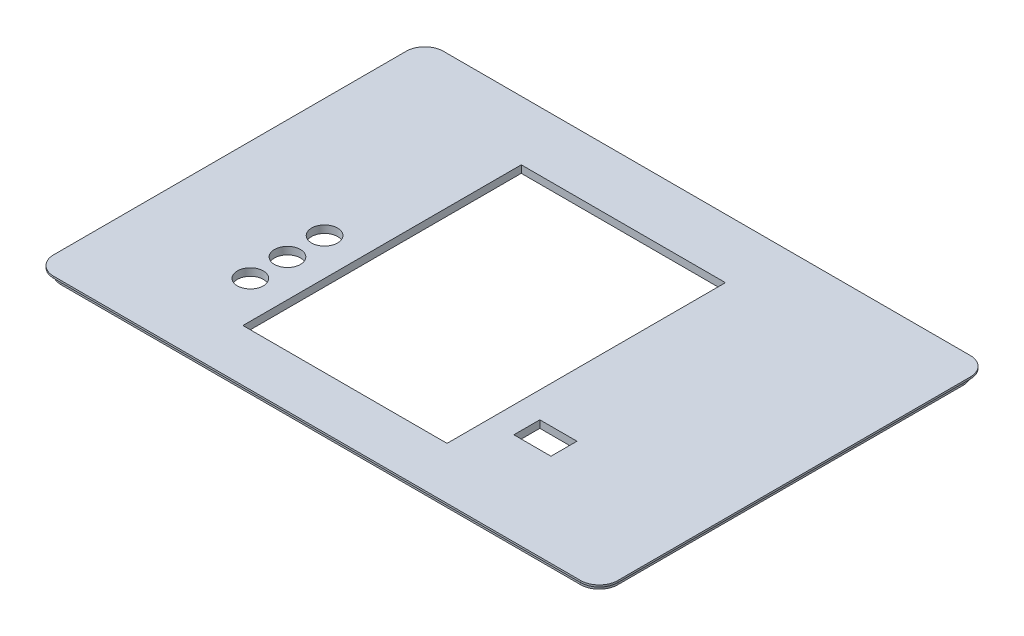
ISO-10303-21;
HEADER;
FILE_DESCRIPTION(('STEP AP214'),'2;1');
FILE_NAME('part.step','',(''),(''),'','','');
FILE_SCHEMA(('AUTOMOTIVE_DESIGN { 1 0 10303 214 1 1 1 1 }'));
ENDSEC;
DATA;
#1=APPLICATION_CONTEXT('core data for automotive mechanical design processes');
#2=APPLICATION_PROTOCOL_DEFINITION('international standard','automotive_design',2000,#1);
#3=PRODUCT_CONTEXT('',#1,'mechanical');
#4=PRODUCT('Part','Part','',(#3));
#5=PRODUCT_RELATED_PRODUCT_CATEGORY('part','',(#4));
#6=PRODUCT_DEFINITION_FORMATION('','',#4);
#7=PRODUCT_DEFINITION_CONTEXT('part definition',#1,'design');
#8=PRODUCT_DEFINITION('design','',#6,#7);
#9=PRODUCT_DEFINITION_SHAPE('','',#8);
#10=(LENGTH_UNIT() NAMED_UNIT(*) SI_UNIT(.MILLI.,.METRE.));
#11=(NAMED_UNIT(*) PLANE_ANGLE_UNIT() SI_UNIT($,.RADIAN.));
#12=(NAMED_UNIT(*) SI_UNIT($,.STERADIAN.) SOLID_ANGLE_UNIT());
#13=UNCERTAINTY_MEASURE_WITH_UNIT(LENGTH_MEASURE(1.E-05),#10,'distance_accuracy_value','');
#14=(GEOMETRIC_REPRESENTATION_CONTEXT(3) GLOBAL_UNCERTAINTY_ASSIGNED_CONTEXT((#13)) GLOBAL_UNIT_ASSIGNED_CONTEXT((#10,
#11,#12)) REPRESENTATION_CONTEXT('',''));
#15=CARTESIAN_POINT('',(0.,0.,0.));
#16=DIRECTION('',(0.,0.,1.));
#17=DIRECTION('',(1.,0.,0.));
#18=AXIS2_PLACEMENT_3D('',#15,#16,#17);
#19=CARTESIAN_POINT('',(-71.,0.5,47.5));
#20=DIRECTION('',(0.,-1.,0.));
#21=DIRECTION('',(0.,0.,-1.));
#22=AXIS2_PLACEMENT_3D('',#19,#20,#21);
#23=CYLINDRICAL_SURFACE('',#22,5.00000000000001);
#24=CARTESIAN_POINT('',(-71.,0.,47.5));
#25=DIRECTION('',(0.,1.,0.));
#26=DIRECTION('',(0.,0.,-1.));
#27=AXIS2_PLACEMENT_3D('',#24,#25,#26);
#28=CIRCLE('',#27,5.00000000000001);
#29=CARTESIAN_POINT('',(-76.,0.,47.5));
#30=VERTEX_POINT('',#29);
#31=CARTESIAN_POINT('',(-71.,0.,52.5));
#32=VERTEX_POINT('',#31);
#33=EDGE_CURVE('E358',#30,#32,#28,.T.);
#34=ORIENTED_EDGE('',*,*,#33,.T.);
#35=DIRECTION('',(0.,-1.,0.));
#36=VECTOR('',#35,1.);
#37=CARTESIAN_POINT('',(-71.,0.5,52.5));
#38=LINE('',#37,#36);
#39=CARTESIAN_POINT('',(-71.,0.5,52.5));
#40=VERTEX_POINT('',#39);
#41=EDGE_CURVE('E436',#40,#32,#38,.T.);
#42=ORIENTED_EDGE('',*,*,#41,.F.);
#43=CARTESIAN_POINT('',(-71.,0.5,47.5));
#44=DIRECTION('',(0.,1.,0.));
#45=DIRECTION('',(0.,0.,-1.));
#46=AXIS2_PLACEMENT_3D('',#43,#44,#45);
#47=CIRCLE('',#46,5.00000000000001);
#48=CARTESIAN_POINT('',(-76.,0.5,47.5));
#49=VERTEX_POINT('',#48);
#50=EDGE_CURVE('E359',#49,#40,#47,.T.);
#51=ORIENTED_EDGE('',*,*,#50,.F.);
#52=DIRECTION('',(0.,-1.,0.));
#53=VECTOR('',#52,1.);
#54=CARTESIAN_POINT('',(-76.,0.5,47.5));
#55=LINE('',#54,#53);
#56=EDGE_CURVE('E385',#49,#30,#55,.T.);
#57=ORIENTED_EDGE('',*,*,#56,.T.);
#58=EDGE_LOOP('',(#34,#42,#51,#57));
#59=FACE_BOUND('',#58,.T.);
#60=ADVANCED_FACE('F43',(#59),#23,.T.);
#61=CARTESIAN_POINT('',(71.,0.5,52.5));
#62=DIRECTION('',(0.,0.,-1.));
#63=DIRECTION('',(-1.,0.,0.));
#64=AXIS2_PLACEMENT_3D('',#61,#62,#63);
#65=PLANE('',#64);
#66=DIRECTION('',(1.,0.,0.));
#67=VECTOR('',#66,1.);
#68=CARTESIAN_POINT('',(71.,0.,52.5));
#69=LINE('',#68,#67);
#70=CARTESIAN_POINT('',(71.,0.,52.5));
#71=VERTEX_POINT('',#70);
#72=EDGE_CURVE('E389',#32,#71,#69,.T.);
#73=ORIENTED_EDGE('',*,*,#72,.T.);
#74=DIRECTION('',(0.,-1.,0.));
#75=VECTOR('',#74,1.);
#76=CARTESIAN_POINT('',(71.,0.5,52.5));
#77=LINE('',#76,#75);
#78=CARTESIAN_POINT('',(71.,0.5,52.5));
#79=VERTEX_POINT('',#78);
#80=EDGE_CURVE('E432',#79,#71,#77,.T.);
#81=ORIENTED_EDGE('',*,*,#80,.F.);
#82=DIRECTION('',(1.,0.,0.));
#83=VECTOR('',#82,1.);
#84=CARTESIAN_POINT('',(71.,0.5,52.5));
#85=LINE('',#84,#83);
#86=EDGE_CURVE('E363',#40,#79,#85,.T.);
#87=ORIENTED_EDGE('',*,*,#86,.F.);
#88=ORIENTED_EDGE('',*,*,#41,.T.);
#89=EDGE_LOOP('',(#73,#81,#87,#88));
#90=FACE_BOUND('',#89,.T.);
#91=ADVANCED_FACE('F587',(#90),#65,.F.);
#92=CARTESIAN_POINT('',(71.,0.5,47.5));
#93=DIRECTION('',(0.,-1.,0.));
#94=DIRECTION('',(0.,0.,-1.));
#95=AXIS2_PLACEMENT_3D('',#92,#93,#94);
#96=CYLINDRICAL_SURFACE('',#95,4.99999999999999);
#97=CARTESIAN_POINT('',(71.,0.,47.5));
#98=DIRECTION('',(0.,1.,0.));
#99=DIRECTION('',(0.,0.,1.));
#100=AXIS2_PLACEMENT_3D('',#97,#98,#99);
#101=CIRCLE('',#100,4.99999999999999);
#102=CARTESIAN_POINT('',(76.,0.,47.5));
#103=VERTEX_POINT('',#102);
#104=EDGE_CURVE('E392',#71,#103,#101,.T.);
#105=ORIENTED_EDGE('',*,*,#104,.T.);
#106=DIRECTION('',(0.,-1.,0.));
#107=VECTOR('',#106,1.);
#108=CARTESIAN_POINT('',(76.,0.5,47.5));
#109=LINE('',#108,#107);
#110=CARTESIAN_POINT('',(76.,0.5,47.5));
#111=VERTEX_POINT('',#110);
#112=EDGE_CURVE('E428',#111,#103,#109,.T.);
#113=ORIENTED_EDGE('',*,*,#112,.F.);
#114=CARTESIAN_POINT('',(71.,0.5,47.5));
#115=DIRECTION('',(0.,1.,0.));
#116=DIRECTION('',(0.,0.,1.));
#117=AXIS2_PLACEMENT_3D('',#114,#115,#116);
#118=CIRCLE('',#117,4.99999999999999);
#119=EDGE_CURVE('E367',#79,#111,#118,.T.);
#120=ORIENTED_EDGE('',*,*,#119,.F.);
#121=ORIENTED_EDGE('',*,*,#80,.T.);
#122=EDGE_LOOP('',(#105,#113,#120,#121));
#123=FACE_BOUND('',#122,.T.);
#124=ADVANCED_FACE('F583',(#123),#96,.T.);
#125=CARTESIAN_POINT('',(76.,0.5,47.5));
#126=DIRECTION('',(-1.,0.,0.));
#127=DIRECTION('',(0.,0.,1.));
#128=AXIS2_PLACEMENT_3D('',#125,#126,#127);
#129=PLANE('',#128);
#130=DIRECTION('',(0.,0.,-1.));
#131=VECTOR('',#130,1.);
#132=CARTESIAN_POINT('',(76.,0.,47.5));
#133=LINE('',#132,#131);
#134=CARTESIAN_POINT('',(76.,0.,-47.5));
#135=VERTEX_POINT('',#134);
#136=EDGE_CURVE('E395',#103,#135,#133,.T.);
#137=ORIENTED_EDGE('',*,*,#136,.T.);
#138=DIRECTION('',(0.,-1.,0.));
#139=VECTOR('',#138,1.);
#140=CARTESIAN_POINT('',(76.,0.5,-47.5));
#141=LINE('',#140,#139);
#142=CARTESIAN_POINT('',(76.,0.5,-47.5));
#143=VERTEX_POINT('',#142);
#144=EDGE_CURVE('E424',#143,#135,#141,.T.);
#145=ORIENTED_EDGE('',*,*,#144,.F.);
#146=DIRECTION('',(0.,0.,-1.));
#147=VECTOR('',#146,1.);
#148=CARTESIAN_POINT('',(76.,0.5,47.5));
#149=LINE('',#148,#147);
#150=EDGE_CURVE('E370',#111,#143,#149,.T.);
#151=ORIENTED_EDGE('',*,*,#150,.F.);
#152=ORIENTED_EDGE('',*,*,#112,.T.);
#153=EDGE_LOOP('',(#137,#145,#151,#152));
#154=FACE_BOUND('',#153,.T.);
#155=ADVANCED_FACE('F580',(#154),#129,.F.);
#156=CARTESIAN_POINT('',(71.,0.5,-47.5));
#157=DIRECTION('',(0.,-1.,0.));
#158=DIRECTION('',(0.,0.,-1.));
#159=AXIS2_PLACEMENT_3D('',#156,#157,#158);
#160=CYLINDRICAL_SURFACE('',#159,4.99999999999999);
#161=CARTESIAN_POINT('',(71.,0.,-47.5));
#162=DIRECTION('',(0.,1.,0.));
#163=DIRECTION('',(0.,0.,1.));
#164=AXIS2_PLACEMENT_3D('',#161,#162,#163);
#165=CIRCLE('',#164,4.99999999999999);
#166=CARTESIAN_POINT('',(71.,0.,-52.5));
#167=VERTEX_POINT('',#166);
#168=EDGE_CURVE('E398',#135,#167,#165,.T.);
#169=ORIENTED_EDGE('',*,*,#168,.T.);
#170=DIRECTION('',(0.,-1.,0.));
#171=VECTOR('',#170,1.);
#172=CARTESIAN_POINT('',(71.,0.5,-52.5));
#173=LINE('',#172,#171);
#174=CARTESIAN_POINT('',(71.,0.5,-52.5));
#175=VERTEX_POINT('',#174);
#176=EDGE_CURVE('E420',#175,#167,#173,.T.);
#177=ORIENTED_EDGE('',*,*,#176,.F.);
#178=CARTESIAN_POINT('',(71.,0.5,-47.5));
#179=DIRECTION('',(0.,1.,0.));
#180=DIRECTION('',(0.,0.,1.));
#181=AXIS2_PLACEMENT_3D('',#178,#179,#180);
#182=CIRCLE('',#181,4.99999999999999);
#183=EDGE_CURVE('E373',#143,#175,#182,.T.);
#184=ORIENTED_EDGE('',*,*,#183,.F.);
#185=ORIENTED_EDGE('',*,*,#144,.T.);
#186=EDGE_LOOP('',(#169,#177,#184,#185));
#187=FACE_BOUND('',#186,.T.);
#188=ADVANCED_FACE('F576',(#187),#160,.T.);
#189=CARTESIAN_POINT('',(71.,0.5,-52.5));
#190=DIRECTION('',(0.,0.,1.));
#191=DIRECTION('',(1.,0.,0.));
#192=AXIS2_PLACEMENT_3D('',#189,#190,#191);
#193=PLANE('',#192);
#194=DIRECTION('',(-1.,0.,0.));
#195=VECTOR('',#194,1.);
#196=CARTESIAN_POINT('',(71.,0.,-52.5));
#197=LINE('',#196,#195);
#198=CARTESIAN_POINT('',(-71.,0.,-52.5));
#199=VERTEX_POINT('',#198);
#200=EDGE_CURVE('E401',#167,#199,#197,.T.);
#201=ORIENTED_EDGE('',*,*,#200,.T.);
#202=DIRECTION('',(0.,-1.,0.));
#203=VECTOR('',#202,1.);
#204=CARTESIAN_POINT('',(-71.,0.5,-52.5));
#205=LINE('',#204,#203);
#206=CARTESIAN_POINT('',(-71.,0.5,-52.5));
#207=VERTEX_POINT('',#206);
#208=EDGE_CURVE('E416',#207,#199,#205,.T.);
#209=ORIENTED_EDGE('',*,*,#208,.F.);
#210=DIRECTION('',(-1.,0.,0.));
#211=VECTOR('',#210,1.);
#212=CARTESIAN_POINT('',(71.,0.5,-52.5));
#213=LINE('',#212,#211);
#214=EDGE_CURVE('E376',#175,#207,#213,.T.);
#215=ORIENTED_EDGE('',*,*,#214,.F.);
#216=ORIENTED_EDGE('',*,*,#176,.T.);
#217=EDGE_LOOP('',(#201,#209,#215,#216));
#218=FACE_BOUND('',#217,.T.);
#219=ADVANCED_FACE('F571',(#218),#193,.F.);
#220=CARTESIAN_POINT('',(-71.,0.5,-47.5));
#221=DIRECTION('',(0.,-1.,0.));
#222=DIRECTION('',(0.,0.,-1.));
#223=AXIS2_PLACEMENT_3D('',#220,#221,#222);
#224=CYLINDRICAL_SURFACE('',#223,5.00000000000001);
#225=CARTESIAN_POINT('',(-71.,0.,-47.5));
#226=DIRECTION('',(0.,1.,0.));
#227=DIRECTION('',(0.,0.,1.));
#228=AXIS2_PLACEMENT_3D('',#225,#226,#227);
#229=CIRCLE('',#228,5.00000000000001);
#230=CARTESIAN_POINT('',(-76.,0.,-47.5));
#231=VERTEX_POINT('',#230);
#232=EDGE_CURVE('E404',#199,#231,#229,.T.);
#233=ORIENTED_EDGE('',*,*,#232,.T.);
#234=DIRECTION('',(0.,-1.,0.));
#235=VECTOR('',#234,1.);
#236=CARTESIAN_POINT('',(-76.,0.5,-47.5));
#237=LINE('',#236,#235);
#238=CARTESIAN_POINT('',(-76.,0.5,-47.5));
#239=VERTEX_POINT('',#238);
#240=EDGE_CURVE('E412',#239,#231,#237,.T.);
#241=ORIENTED_EDGE('',*,*,#240,.F.);
#242=CARTESIAN_POINT('',(-71.,0.5,-47.5));
#243=DIRECTION('',(0.,1.,0.));
#244=DIRECTION('',(0.,0.,1.));
#245=AXIS2_PLACEMENT_3D('',#242,#243,#244);
#246=CIRCLE('',#245,5.00000000000001);
#247=EDGE_CURVE('E379',#207,#239,#246,.T.);
#248=ORIENTED_EDGE('',*,*,#247,.F.);
#249=ORIENTED_EDGE('',*,*,#208,.T.);
#250=EDGE_LOOP('',(#233,#241,#248,#249));
#251=FACE_BOUND('',#250,.T.);
#252=ADVANCED_FACE('F565',(#251),#224,.T.);
#253=CARTESIAN_POINT('',(-76.,0.5,47.5));
#254=DIRECTION('',(1.,0.,0.));
#255=DIRECTION('',(0.,0.,-1.));
#256=AXIS2_PLACEMENT_3D('',#253,#254,#255);
#257=PLANE('',#256);
#258=DIRECTION('',(0.,0.,1.));
#259=VECTOR('',#258,1.);
#260=CARTESIAN_POINT('',(-76.,0.,47.5));
#261=LINE('',#260,#259);
#262=EDGE_CURVE('E364',#231,#30,#261,.T.);
#263=ORIENTED_EDGE('',*,*,#262,.T.);
#264=ORIENTED_EDGE('',*,*,#56,.F.);
#265=DIRECTION('',(0.,0.,1.));
#266=VECTOR('',#265,1.);
#267=CARTESIAN_POINT('',(-76.,0.5,47.5));
#268=LINE('',#267,#266);
#269=EDGE_CURVE('E382',#239,#49,#268,.T.);
#270=ORIENTED_EDGE('',*,*,#269,.F.);
#271=ORIENTED_EDGE('',*,*,#240,.T.);
#272=EDGE_LOOP('',(#263,#264,#270,#271));
#273=FACE_BOUND('',#272,.T.);
#274=ADVANCED_FACE('F497',(#273),#257,.F.);
#275=CARTESIAN_POINT('',(-71.,0.5,47.5));
#276=DIRECTION('',(0.,-1.,0.));
#277=DIRECTION('',(0.,0.,-1.));
#278=AXIS2_PLACEMENT_3D('',#275,#276,#277);
#279=PLANE('',#278);
#280=CARTESIAN_POINT('',(-44.,0.5,6.49999999999999));
#281=DIRECTION('',(0.,1.,0.));
#282=DIRECTION('',(0.,0.,1.));
#283=AXIS2_PLACEMENT_3D('',#280,#281,#282);
#284=CIRCLE('',#283,3.5);
#285=CARTESIAN_POINT('',(-44.,0.5,9.99999999999999));
#286=VERTEX_POINT('',#285);
#287=EDGE_CURVE('E468',#286,#286,#284,.T.);
#288=ORIENTED_EDGE('',*,*,#287,.F.);
#289=EDGE_LOOP('',(#288));
#290=FACE_BOUND('',#289,.T.);
#291=CARTESIAN_POINT('',(-44.,0.5,16.5));
#292=DIRECTION('',(0.,1.,0.));
#293=DIRECTION('',(0.,0.,1.));
#294=AXIS2_PLACEMENT_3D('',#291,#292,#293);
#295=CIRCLE('',#294,3.5);
#296=CARTESIAN_POINT('',(-44.,0.5,20.));
#297=VERTEX_POINT('',#296);
#298=EDGE_CURVE('E483',#297,#297,#295,.T.);
#299=ORIENTED_EDGE('',*,*,#298,.F.);
#300=EDGE_LOOP('',(#299));
#301=FACE_BOUND('',#300,.T.);
#302=CARTESIAN_POINT('',(-44.,0.5,26.5));
#303=DIRECTION('',(0.,1.,0.));
#304=DIRECTION('',(0.,0.,1.));
#305=AXIS2_PLACEMENT_3D('',#302,#303,#304);
#306=CIRCLE('',#305,3.5);
#307=CARTESIAN_POINT('',(-44.,0.5,30.));
#308=VERTEX_POINT('',#307);
#309=EDGE_CURVE('E479',#308,#308,#306,.T.);
#310=ORIENTED_EDGE('',*,*,#309,.F.);
#311=EDGE_LOOP('',(#310));
#312=FACE_BOUND('',#311,.T.);
#313=DIRECTION('',(1.,0.,0.));
#314=VECTOR('',#313,1.);
#315=CARTESIAN_POINT('',(28.,0.5,27.5));
#316=LINE('',#315,#314);
#317=CARTESIAN_POINT('',(28.,0.5,27.5));
#318=VERTEX_POINT('',#317);
#319=CARTESIAN_POINT('',(38.,0.5,27.5));
#320=VERTEX_POINT('',#319);
#321=EDGE_CURVE('E219',#318,#320,#316,.T.);
#322=ORIENTED_EDGE('',*,*,#321,.F.);
#323=DIRECTION('',(0.,0.,1.));
#324=VECTOR('',#323,1.);
#325=CARTESIAN_POINT('',(28.,0.5,20.5));
#326=LINE('',#325,#324);
#327=CARTESIAN_POINT('',(28.,0.5,20.5));
#328=VERTEX_POINT('',#327);
#329=EDGE_CURVE('E60',#328,#318,#326,.T.);
#330=ORIENTED_EDGE('',*,*,#329,.F.);
#331=DIRECTION('',(-1.,0.,0.));
#332=VECTOR('',#331,1.);
#333=CARTESIAN_POINT('',(28.,0.5,20.5));
#334=LINE('',#333,#332);
#335=CARTESIAN_POINT('',(38.,0.5,20.5));
#336=VERTEX_POINT('',#335);
#337=EDGE_CURVE('E227',#336,#328,#334,.T.);
#338=ORIENTED_EDGE('',*,*,#337,.F.);
#339=DIRECTION('',(0.,0.,-1.));
#340=VECTOR('',#339,1.);
#341=CARTESIAN_POINT('',(38.,0.5,20.5));
#342=LINE('',#341,#340);
#343=EDGE_CURVE('E209',#320,#336,#342,.T.);
#344=ORIENTED_EDGE('',*,*,#343,.F.);
#345=EDGE_LOOP('',(#322,#330,#338,#344));
#346=FACE_BOUND('',#345,.T.);
#347=DIRECTION('',(1.,0.,0.));
#348=VECTOR('',#347,1.);
#349=CARTESIAN_POINT('',(-34.,0.5,38.5));
#350=LINE('',#349,#348);
#351=CARTESIAN_POINT('',(-34.,0.5,38.5));
#352=VERTEX_POINT('',#351);
#353=CARTESIAN_POINT('',(21.,0.5,38.5));
#354=VERTEX_POINT('',#353);
#355=EDGE_CURVE('E244',#352,#354,#350,.T.);
#356=ORIENTED_EDGE('',*,*,#355,.F.);
#357=DIRECTION('',(0.,0.,1.));
#358=VECTOR('',#357,1.);
#359=CARTESIAN_POINT('',(-34.,0.5,-36.5));
#360=LINE('',#359,#358);
#361=CARTESIAN_POINT('',(-34.,0.5,-36.5));
#362=VERTEX_POINT('',#361);
#363=EDGE_CURVE('E237',#362,#352,#360,.T.);
#364=ORIENTED_EDGE('',*,*,#363,.F.);
#365=DIRECTION('',(-1.,0.,0.));
#366=VECTOR('',#365,1.);
#367=CARTESIAN_POINT('',(-34.,0.5,-36.5));
#368=LINE('',#367,#366);
#369=CARTESIAN_POINT('',(21.,0.5,-36.5));
#370=VERTEX_POINT('',#369);
#371=EDGE_CURVE('E252',#370,#362,#368,.T.);
#372=ORIENTED_EDGE('',*,*,#371,.F.);
#373=DIRECTION('',(0.,0.,-1.));
#374=VECTOR('',#373,1.);
#375=CARTESIAN_POINT('',(21.,0.5,-36.5));
#376=LINE('',#375,#374);
#377=EDGE_CURVE('E248',#354,#370,#376,.T.);
#378=ORIENTED_EDGE('',*,*,#377,.F.);
#379=EDGE_LOOP('',(#356,#364,#372,#378));
#380=FACE_BOUND('',#379,.T.);
#381=ORIENTED_EDGE('',*,*,#50,.T.);
#382=ORIENTED_EDGE('',*,*,#86,.T.);
#383=ORIENTED_EDGE('',*,*,#119,.T.);
#384=ORIENTED_EDGE('',*,*,#150,.T.);
#385=ORIENTED_EDGE('',*,*,#183,.T.);
#386=ORIENTED_EDGE('',*,*,#214,.T.);
#387=ORIENTED_EDGE('',*,*,#247,.T.);
#388=ORIENTED_EDGE('',*,*,#269,.T.);
#389=EDGE_LOOP('',(#381,#382,#383,#384,#385,#386,#387,#388));
#390=FACE_BOUND('',#389,.T.);
#391=ADVANCED_FACE('F224',(#290,#301,#312,#346,#380,#390),#279,.F.);
#392=CARTESIAN_POINT('',(-71.,0.,47.5));
#393=DIRECTION('',(0.,-1.,0.));
#394=DIRECTION('',(0.,0.,-1.));
#395=AXIS2_PLACEMENT_3D('',#392,#393,#394);
#396=PLANE('',#395);
#397=CARTESIAN_POINT('',(-70.,0.,-46.5));
#398=DIRECTION('',(0.,-1.,0.));
#399=DIRECTION('',(0.,0.,1.));
#400=AXIS2_PLACEMENT_3D('',#397,#398,#399);
#401=CIRCLE('',#400,5.);
#402=CARTESIAN_POINT('',(-75.,0.,-46.5));
#403=VERTEX_POINT('',#402);
#404=CARTESIAN_POINT('',(-70.,0.,-51.5));
#405=VERTEX_POINT('',#404);
#406=EDGE_CURVE('E260',#403,#405,#401,.T.);
#407=ORIENTED_EDGE('',*,*,#406,.F.);
#408=DIRECTION('',(0.,0.,-1.));
#409=VECTOR('',#408,1.);
#410=CARTESIAN_POINT('',(-75.,0.,-46.5));
#411=LINE('',#410,#409);
#412=CARTESIAN_POINT('',(-75.,0.,46.5));
#413=VERTEX_POINT('',#412);
#414=EDGE_CURVE('E275',#413,#403,#411,.T.);
#415=ORIENTED_EDGE('',*,*,#414,.F.);
#416=CARTESIAN_POINT('',(-70.,0.,46.5));
#417=DIRECTION('',(0.,-1.,0.));
#418=DIRECTION('',(0.,0.,-1.));
#419=AXIS2_PLACEMENT_3D('',#416,#417,#418);
#420=CIRCLE('',#419,5.);
#421=CARTESIAN_POINT('',(-70.,0.,51.5));
#422=VERTEX_POINT('',#421);
#423=EDGE_CURVE('E320',#422,#413,#420,.T.);
#424=ORIENTED_EDGE('',*,*,#423,.F.);
#425=DIRECTION('',(-1.,0.,0.));
#426=VECTOR('',#425,1.);
#427=CARTESIAN_POINT('',(70.,0.,51.5));
#428=LINE('',#427,#426);
#429=CARTESIAN_POINT('',(70.,0.,51.5));
#430=VERTEX_POINT('',#429);
#431=EDGE_CURVE('E316',#430,#422,#428,.T.);
#432=ORIENTED_EDGE('',*,*,#431,.F.);
#433=CARTESIAN_POINT('',(70.,0.,46.5));
#434=DIRECTION('',(0.,-1.,0.));
#435=DIRECTION('',(0.,0.,-1.));
#436=AXIS2_PLACEMENT_3D('',#433,#434,#435);
#437=CIRCLE('',#436,5.);
#438=CARTESIAN_POINT('',(75.,0.,46.5));
#439=VERTEX_POINT('',#438);
#440=EDGE_CURVE('E312',#439,#430,#437,.T.);
#441=ORIENTED_EDGE('',*,*,#440,.F.);
#442=DIRECTION('',(0.,0.,1.));
#443=VECTOR('',#442,1.);
#444=CARTESIAN_POINT('',(75.,0.,-46.5));
#445=LINE('',#444,#443);
#446=CARTESIAN_POINT('',(75.,0.,-46.5));
#447=VERTEX_POINT('',#446);
#448=EDGE_CURVE('E308',#447,#439,#445,.T.);
#449=ORIENTED_EDGE('',*,*,#448,.F.);
#450=CARTESIAN_POINT('',(70.,0.,-46.5));
#451=DIRECTION('',(0.,-1.,0.));
#452=DIRECTION('',(0.,0.,-1.));
#453=AXIS2_PLACEMENT_3D('',#450,#451,#452);
#454=CIRCLE('',#453,5.);
#455=CARTESIAN_POINT('',(70.,0.,-51.5));
#456=VERTEX_POINT('',#455);
#457=EDGE_CURVE('E304',#456,#447,#454,.T.);
#458=ORIENTED_EDGE('',*,*,#457,.F.);
#459=DIRECTION('',(1.,0.,0.));
#460=VECTOR('',#459,1.);
#461=CARTESIAN_POINT('',(70.,0.,-51.5));
#462=LINE('',#461,#460);
#463=EDGE_CURVE('E300',#405,#456,#462,.T.);
#464=ORIENTED_EDGE('',*,*,#463,.F.);
#465=EDGE_LOOP('',(#407,#415,#424,#432,#441,#449,#458,#464));
#466=FACE_BOUND('',#465,.T.);
#467=ORIENTED_EDGE('',*,*,#33,.F.);
#468=ORIENTED_EDGE('',*,*,#262,.F.);
#469=ORIENTED_EDGE('',*,*,#232,.F.);
#470=ORIENTED_EDGE('',*,*,#200,.F.);
#471=ORIENTED_EDGE('',*,*,#168,.F.);
#472=ORIENTED_EDGE('',*,*,#136,.F.);
#473=ORIENTED_EDGE('',*,*,#104,.F.);
#474=ORIENTED_EDGE('',*,*,#72,.F.);
#475=EDGE_LOOP('',(#467,#468,#469,#470,#471,#472,#473,#474));
#476=FACE_BOUND('',#475,.T.);
#477=ADVANCED_FACE('F496',(#466,#476),#396,.T.);
#478=CARTESIAN_POINT('',(-70.,-1.5,-46.5));
#479=DIRECTION('',(0.,1.,0.));
#480=DIRECTION('',(0.,0.,1.));
#481=AXIS2_PLACEMENT_3D('',#478,#479,#480);
#482=CYLINDRICAL_SURFACE('',#481,5.);
#483=ORIENTED_EDGE('',*,*,#406,.T.);
#484=DIRECTION('',(0.,1.,0.));
#485=VECTOR('',#484,1.);
#486=CARTESIAN_POINT('',(-70.,-1.5,-51.5));
#487=LINE('',#486,#485);
#488=CARTESIAN_POINT('',(-70.,-1.5,-51.5));
#489=VERTEX_POINT('',#488);
#490=EDGE_CURVE('E354',#489,#405,#487,.T.);
#491=ORIENTED_EDGE('',*,*,#490,.F.);
#492=CARTESIAN_POINT('',(-70.,-1.5,-46.5));
#493=DIRECTION('',(0.,-1.,0.));
#494=DIRECTION('',(0.,0.,1.));
#495=AXIS2_PLACEMENT_3D('',#492,#493,#494);
#496=CIRCLE('',#495,5.);
#497=CARTESIAN_POINT('',(-75.,-1.5,-46.5));
#498=VERTEX_POINT('',#497);
#499=EDGE_CURVE('E270',#498,#489,#496,.T.);
#500=ORIENTED_EDGE('',*,*,#499,.F.);
#501=DIRECTION('',(0.,1.,0.));
#502=VECTOR('',#501,1.);
#503=CARTESIAN_POINT('',(-75.,-1.5,-46.5));
#504=LINE('',#503,#502);
#505=EDGE_CURVE('E296',#498,#403,#504,.T.);
#506=ORIENTED_EDGE('',*,*,#505,.T.);
#507=EDGE_LOOP('',(#483,#491,#500,#506));
#508=FACE_BOUND('',#507,.T.);
#509=ADVANCED_FACE('F524',(#508),#482,.T.);
#510=CARTESIAN_POINT('',(70.,-1.5,-51.5));
#511=DIRECTION('',(0.,0.,1.));
#512=DIRECTION('',(1.,0.,0.));
#513=AXIS2_PLACEMENT_3D('',#510,#511,#512);
#514=PLANE('',#513);
#515=ORIENTED_EDGE('',*,*,#463,.T.);
#516=DIRECTION('',(0.,1.,0.));
#517=VECTOR('',#516,1.);
#518=CARTESIAN_POINT('',(70.,-1.5,-51.5));
#519=LINE('',#518,#517);
#520=CARTESIAN_POINT('',(70.,-1.5,-51.5));
#521=VERTEX_POINT('',#520);
#522=EDGE_CURVE('E350',#521,#456,#519,.T.);
#523=ORIENTED_EDGE('',*,*,#522,.F.);
#524=DIRECTION('',(1.,0.,0.));
#525=VECTOR('',#524,1.);
#526=CARTESIAN_POINT('',(70.,-1.5,-51.5));
#527=LINE('',#526,#525);
#528=EDGE_CURVE('E274',#489,#521,#527,.T.);
#529=ORIENTED_EDGE('',*,*,#528,.F.);
#530=ORIENTED_EDGE('',*,*,#490,.T.);
#531=EDGE_LOOP('',(#515,#523,#529,#530));
#532=FACE_BOUND('',#531,.T.);
#533=ADVANCED_FACE('F526',(#532),#514,.F.);
#534=CARTESIAN_POINT('',(70.,-1.5,-46.5));
#535=DIRECTION('',(0.,1.,0.));
#536=DIRECTION('',(0.,0.,1.));
#537=AXIS2_PLACEMENT_3D('',#534,#535,#536);
#538=CYLINDRICAL_SURFACE('',#537,5.);
#539=ORIENTED_EDGE('',*,*,#457,.T.);
#540=DIRECTION('',(0.,1.,0.));
#541=VECTOR('',#540,1.);
#542=CARTESIAN_POINT('',(75.,-1.5,-46.5));
#543=LINE('',#542,#541);
#544=CARTESIAN_POINT('',(75.,-1.5,-46.5));
#545=VERTEX_POINT('',#544);
#546=EDGE_CURVE('E346',#545,#447,#543,.T.);
#547=ORIENTED_EDGE('',*,*,#546,.F.);
#548=CARTESIAN_POINT('',(70.,-1.5,-46.5));
#549=DIRECTION('',(0.,-1.,0.));
#550=DIRECTION('',(0.,0.,-1.));
#551=AXIS2_PLACEMENT_3D('',#548,#549,#550);
#552=CIRCLE('',#551,5.);
#553=EDGE_CURVE('E278',#521,#545,#552,.T.);
#554=ORIENTED_EDGE('',*,*,#553,.F.);
#555=ORIENTED_EDGE('',*,*,#522,.T.);
#556=EDGE_LOOP('',(#539,#547,#554,#555));
#557=FACE_BOUND('',#556,.T.);
#558=ADVANCED_FACE('F530',(#557),#538,.T.);
#559=CARTESIAN_POINT('',(75.,-1.5,-46.5));
#560=DIRECTION('',(-1.,0.,0.));
#561=DIRECTION('',(0.,0.,1.));
#562=AXIS2_PLACEMENT_3D('',#559,#560,#561);
#563=PLANE('',#562);
#564=ORIENTED_EDGE('',*,*,#448,.T.);
#565=DIRECTION('',(0.,1.,0.));
#566=VECTOR('',#565,1.);
#567=CARTESIAN_POINT('',(75.,-1.5,46.5));
#568=LINE('',#567,#566);
#569=CARTESIAN_POINT('',(75.,-1.5,46.5));
#570=VERTEX_POINT('',#569);
#571=EDGE_CURVE('E342',#570,#439,#568,.T.);
#572=ORIENTED_EDGE('',*,*,#571,.F.);
#573=DIRECTION('',(0.,0.,1.));
#574=VECTOR('',#573,1.);
#575=CARTESIAN_POINT('',(75.,-1.5,-46.5));
#576=LINE('',#575,#574);
#577=EDGE_CURVE('E281',#545,#570,#576,.T.);
#578=ORIENTED_EDGE('',*,*,#577,.F.);
#579=ORIENTED_EDGE('',*,*,#546,.T.);
#580=EDGE_LOOP('',(#564,#572,#578,#579));
#581=FACE_BOUND('',#580,.T.);
#582=ADVANCED_FACE('F536',(#581),#563,.F.);
#583=CARTESIAN_POINT('',(70.,-1.5,46.5));
#584=DIRECTION('',(0.,1.,0.));
#585=DIRECTION('',(0.,0.,1.));
#586=AXIS2_PLACEMENT_3D('',#583,#584,#585);
#587=CYLINDRICAL_SURFACE('',#586,5.);
#588=ORIENTED_EDGE('',*,*,#440,.T.);
#589=DIRECTION('',(0.,1.,0.));
#590=VECTOR('',#589,1.);
#591=CARTESIAN_POINT('',(70.,-1.5,51.5));
#592=LINE('',#591,#590);
#593=CARTESIAN_POINT('',(70.,-1.5,51.5));
#594=VERTEX_POINT('',#593);
#595=EDGE_CURVE('E338',#594,#430,#592,.T.);
#596=ORIENTED_EDGE('',*,*,#595,.F.);
#597=CARTESIAN_POINT('',(70.,-1.5,46.5));
#598=DIRECTION('',(0.,-1.,0.));
#599=DIRECTION('',(0.,0.,-1.));
#600=AXIS2_PLACEMENT_3D('',#597,#598,#599);
#601=CIRCLE('',#600,5.);
#602=EDGE_CURVE('E284',#570,#594,#601,.T.);
#603=ORIENTED_EDGE('',*,*,#602,.F.);
#604=ORIENTED_EDGE('',*,*,#571,.T.);
#605=EDGE_LOOP('',(#588,#596,#603,#604));
#606=FACE_BOUND('',#605,.T.);
#607=ADVANCED_FACE('F538',(#606),#587,.T.);
#608=CARTESIAN_POINT('',(70.,-1.5,51.5));
#609=DIRECTION('',(0.,0.,-1.));
#610=DIRECTION('',(-1.,0.,0.));
#611=AXIS2_PLACEMENT_3D('',#608,#609,#610);
#612=PLANE('',#611);
#613=ORIENTED_EDGE('',*,*,#431,.T.);
#614=DIRECTION('',(0.,1.,0.));
#615=VECTOR('',#614,1.);
#616=CARTESIAN_POINT('',(-70.,-1.5,51.5));
#617=LINE('',#616,#615);
#618=CARTESIAN_POINT('',(-70.,-1.5,51.5));
#619=VERTEX_POINT('',#618);
#620=EDGE_CURVE('E334',#619,#422,#617,.T.);
#621=ORIENTED_EDGE('',*,*,#620,.F.);
#622=DIRECTION('',(-1.,0.,0.));
#623=VECTOR('',#622,1.);
#624=CARTESIAN_POINT('',(70.,-1.5,51.5));
#625=LINE('',#624,#623);
#626=EDGE_CURVE('E287',#594,#619,#625,.T.);
#627=ORIENTED_EDGE('',*,*,#626,.F.);
#628=ORIENTED_EDGE('',*,*,#595,.T.);
#629=EDGE_LOOP('',(#613,#621,#627,#628));
#630=FACE_BOUND('',#629,.T.);
#631=ADVANCED_FACE('F542',(#630),#612,.F.);
#632=CARTESIAN_POINT('',(-70.,-1.5,46.5));
#633=DIRECTION('',(0.,1.,0.));
#634=DIRECTION('',(0.,0.,1.));
#635=AXIS2_PLACEMENT_3D('',#632,#633,#634);
#636=CYLINDRICAL_SURFACE('',#635,5.);
#637=ORIENTED_EDGE('',*,*,#423,.T.);
#638=DIRECTION('',(0.,1.,0.));
#639=VECTOR('',#638,1.);
#640=CARTESIAN_POINT('',(-75.,-1.5,46.5));
#641=LINE('',#640,#639);
#642=CARTESIAN_POINT('',(-75.,-1.5,46.5));
#643=VERTEX_POINT('',#642);
#644=EDGE_CURVE('E330',#643,#413,#641,.T.);
#645=ORIENTED_EDGE('',*,*,#644,.F.);
#646=CARTESIAN_POINT('',(-70.,-1.5,46.5));
#647=DIRECTION('',(0.,-1.,0.));
#648=DIRECTION('',(0.,0.,-1.));
#649=AXIS2_PLACEMENT_3D('',#646,#647,#648);
#650=CIRCLE('',#649,5.);
#651=EDGE_CURVE('E290',#619,#643,#650,.T.);
#652=ORIENTED_EDGE('',*,*,#651,.F.);
#653=ORIENTED_EDGE('',*,*,#620,.T.);
#654=EDGE_LOOP('',(#637,#645,#652,#653));
#655=FACE_BOUND('',#654,.T.);
#656=ADVANCED_FACE('F546',(#655),#636,.T.);
#657=CARTESIAN_POINT('',(-75.,-1.5,-46.5));
#658=DIRECTION('',(1.,0.,0.));
#659=DIRECTION('',(0.,0.,-1.));
#660=AXIS2_PLACEMENT_3D('',#657,#658,#659);
#661=PLANE('',#660);
#662=ORIENTED_EDGE('',*,*,#414,.T.);
#663=ORIENTED_EDGE('',*,*,#505,.F.);
#664=DIRECTION('',(0.,0.,-1.));
#665=VECTOR('',#664,1.);
#666=CARTESIAN_POINT('',(-75.,-1.5,-46.5));
#667=LINE('',#666,#665);
#668=EDGE_CURVE('E293',#643,#498,#667,.T.);
#669=ORIENTED_EDGE('',*,*,#668,.F.);
#670=ORIENTED_EDGE('',*,*,#644,.T.);
#671=EDGE_LOOP('',(#662,#663,#669,#670));
#672=FACE_BOUND('',#671,.T.);
#673=ADVANCED_FACE('F514',(#672),#661,.F.);
#674=CARTESIAN_POINT('',(-70.,-1.5,-46.5));
#675=DIRECTION('',(0.,1.,0.));
#676=DIRECTION('',(0.,0.,1.));
#677=AXIS2_PLACEMENT_3D('',#674,#675,#676);
#678=PLANE('',#677);
#679=CARTESIAN_POINT('',(-44.,-1.5,6.49999999999999));
#680=DIRECTION('',(0.,1.,0.));
#681=DIRECTION('',(0.,0.,1.));
#682=AXIS2_PLACEMENT_3D('',#679,#680,#681);
#683=CIRCLE('',#682,3.5);
#684=CARTESIAN_POINT('',(-44.,-1.5,9.99999999999999));
#685=VERTEX_POINT('',#684);
#686=EDGE_CURVE('E46',#685,#685,#683,.T.);
#687=ORIENTED_EDGE('',*,*,#686,.T.);
#688=EDGE_LOOP('',(#687));
#689=FACE_BOUND('',#688,.T.);
#690=CARTESIAN_POINT('',(-44.,-1.5,16.5));
#691=DIRECTION('',(0.,1.,0.));
#692=DIRECTION('',(0.,0.,1.));
#693=AXIS2_PLACEMENT_3D('',#690,#691,#692);
#694=CIRCLE('',#693,3.5);
#695=CARTESIAN_POINT('',(-44.,-1.5,20.));
#696=VERTEX_POINT('',#695);
#697=EDGE_CURVE('E467',#696,#696,#694,.T.);
#698=ORIENTED_EDGE('',*,*,#697,.T.);
#699=EDGE_LOOP('',(#698));
#700=FACE_BOUND('',#699,.T.);
#701=CARTESIAN_POINT('',(-44.,-1.5,26.5));
#702=DIRECTION('',(0.,1.,0.));
#703=DIRECTION('',(0.,0.,1.));
#704=AXIS2_PLACEMENT_3D('',#701,#702,#703);
#705=CIRCLE('',#704,3.5);
#706=CARTESIAN_POINT('',(-44.,-1.5,30.));
#707=VERTEX_POINT('',#706);
#708=EDGE_CURVE('E464',#707,#707,#705,.T.);
#709=ORIENTED_EDGE('',*,*,#708,.T.);
#710=EDGE_LOOP('',(#709));
#711=FACE_BOUND('',#710,.T.);
#712=DIRECTION('',(-1.,0.,0.));
#713=VECTOR('',#712,1.);
#714=CARTESIAN_POINT('',(-70.,-1.5,20.5));
#715=LINE('',#714,#713);
#716=CARTESIAN_POINT('',(38.,-1.5,20.5));
#717=VERTEX_POINT('',#716);
#718=CARTESIAN_POINT('',(28.,-1.5,20.5));
#719=VERTEX_POINT('',#718);
#720=EDGE_CURVE('E52',#717,#719,#715,.T.);
#721=ORIENTED_EDGE('',*,*,#720,.T.);
#722=DIRECTION('',(0.,0.,1.));
#723=VECTOR('',#722,1.);
#724=CARTESIAN_POINT('',(28.,-1.5,-46.5));
#725=LINE('',#724,#723);
#726=CARTESIAN_POINT('',(28.,-1.5,27.5));
#727=VERTEX_POINT('',#726);
#728=EDGE_CURVE('E11',#719,#727,#725,.T.);
#729=ORIENTED_EDGE('',*,*,#728,.T.);
#730=DIRECTION('',(1.,0.,0.));
#731=VECTOR('',#730,1.);
#732=CARTESIAN_POINT('',(-70.,-1.5,27.5));
#733=LINE('',#732,#731);
#734=CARTESIAN_POINT('',(38.,-1.5,27.5));
#735=VERTEX_POINT('',#734);
#736=EDGE_CURVE('E456',#727,#735,#733,.T.);
#737=ORIENTED_EDGE('',*,*,#736,.T.);
#738=DIRECTION('',(0.,0.,-1.));
#739=VECTOR('',#738,1.);
#740=CARTESIAN_POINT('',(38.,-1.5,-46.5));
#741=LINE('',#740,#739);
#742=EDGE_CURVE('E212',#735,#717,#741,.T.);
#743=ORIENTED_EDGE('',*,*,#742,.T.);
#744=EDGE_LOOP('',(#721,#729,#737,#743));
#745=FACE_BOUND('',#744,.T.);
#746=DIRECTION('',(-1.,0.,0.));
#747=VECTOR('',#746,1.);
#748=CARTESIAN_POINT('',(-70.,-1.5,-36.5));
#749=LINE('',#748,#747);
#750=CARTESIAN_POINT('',(21.,-1.5,-36.5));
#751=VERTEX_POINT('',#750);
#752=CARTESIAN_POINT('',(-34.,-1.5,-36.5));
#753=VERTEX_POINT('',#752);
#754=EDGE_CURVE('E448',#751,#753,#749,.T.);
#755=ORIENTED_EDGE('',*,*,#754,.T.);
#756=DIRECTION('',(0.,0.,1.));
#757=VECTOR('',#756,1.);
#758=CARTESIAN_POINT('',(-34.,-1.5,-46.5));
#759=LINE('',#758,#757);
#760=CARTESIAN_POINT('',(-34.,-1.5,38.5));
#761=VERTEX_POINT('',#760);
#762=EDGE_CURVE('E452',#753,#761,#759,.T.);
#763=ORIENTED_EDGE('',*,*,#762,.T.);
#764=DIRECTION('',(1.,0.,0.));
#765=VECTOR('',#764,1.);
#766=CARTESIAN_POINT('',(-70.,-1.5,38.5));
#767=LINE('',#766,#765);
#768=CARTESIAN_POINT('',(21.,-1.5,38.5));
#769=VERTEX_POINT('',#768);
#770=EDGE_CURVE('E440',#761,#769,#767,.T.);
#771=ORIENTED_EDGE('',*,*,#770,.T.);
#772=DIRECTION('',(0.,0.,-1.));
#773=VECTOR('',#772,1.);
#774=CARTESIAN_POINT('',(21.,-1.5,-46.5));
#775=LINE('',#774,#773);
#776=EDGE_CURVE('E444',#769,#751,#775,.T.);
#777=ORIENTED_EDGE('',*,*,#776,.T.);
#778=EDGE_LOOP('',(#755,#763,#771,#777));
#779=FACE_BOUND('',#778,.T.);
#780=ORIENTED_EDGE('',*,*,#499,.T.);
#781=ORIENTED_EDGE('',*,*,#528,.T.);
#782=ORIENTED_EDGE('',*,*,#553,.T.);
#783=ORIENTED_EDGE('',*,*,#577,.T.);
#784=ORIENTED_EDGE('',*,*,#602,.T.);
#785=ORIENTED_EDGE('',*,*,#626,.T.);
#786=ORIENTED_EDGE('',*,*,#651,.T.);
#787=ORIENTED_EDGE('',*,*,#668,.T.);
#788=EDGE_LOOP('',(#780,#781,#782,#783,#784,#785,#786,#787));
#789=FACE_BOUND('',#788,.T.);
#790=ADVANCED_FACE('F510',(#689,#700,#711,#745,#779,#789),#678,.F.);
#791=CARTESIAN_POINT('',(-34.,-32.5,-36.5));
#792=DIRECTION('',(-1.,0.,0.));
#793=DIRECTION('',(0.,0.,1.));
#794=AXIS2_PLACEMENT_3D('',#791,#792,#793);
#795=PLANE('',#794);
#796=DIRECTION('',(0.,1.,0.));
#797=VECTOR('',#796,1.);
#798=CARTESIAN_POINT('',(-34.,-32.5,-36.5));
#799=LINE('',#798,#797);
#800=EDGE_CURVE('E257',#753,#362,#799,.T.);
#801=ORIENTED_EDGE('',*,*,#800,.T.);
#802=ORIENTED_EDGE('',*,*,#363,.T.);
#803=DIRECTION('',(0.,1.,0.));
#804=VECTOR('',#803,1.);
#805=CARTESIAN_POINT('',(-34.,-32.5,38.5));
#806=LINE('',#805,#804);
#807=EDGE_CURVE('E256',#761,#352,#806,.T.);
#808=ORIENTED_EDGE('',*,*,#807,.F.);
#809=ORIENTED_EDGE('',*,*,#762,.F.);
#810=EDGE_LOOP('',(#801,#802,#808,#809));
#811=FACE_BOUND('',#810,.T.);
#812=ADVANCED_FACE('F513',(#811),#795,.F.);
#813=CARTESIAN_POINT('',(-34.,-32.5,-36.5));
#814=DIRECTION('',(0.,0.,-1.));
#815=DIRECTION('',(-1.,0.,0.));
#816=AXIS2_PLACEMENT_3D('',#813,#814,#815);
#817=PLANE('',#816);
#818=DIRECTION('',(0.,1.,0.));
#819=VECTOR('',#818,1.);
#820=CARTESIAN_POINT('',(21.,-32.5,-36.5));
#821=LINE('',#820,#819);
#822=EDGE_CURVE('E261',#751,#370,#821,.T.);
#823=ORIENTED_EDGE('',*,*,#822,.T.);
#824=ORIENTED_EDGE('',*,*,#371,.T.);
#825=ORIENTED_EDGE('',*,*,#800,.F.);
#826=ORIENTED_EDGE('',*,*,#754,.F.);
#827=EDGE_LOOP('',(#823,#824,#825,#826));
#828=FACE_BOUND('',#827,.T.);
#829=ADVANCED_FACE('F624',(#828),#817,.F.);
#830=CARTESIAN_POINT('',(21.,-32.5,-36.5));
#831=DIRECTION('',(1.,0.,0.));
#832=DIRECTION('',(0.,0.,-1.));
#833=AXIS2_PLACEMENT_3D('',#830,#831,#832);
#834=PLANE('',#833);
#835=DIRECTION('',(0.,1.,0.));
#836=VECTOR('',#835,1.);
#837=CARTESIAN_POINT('',(21.,-32.5,38.5));
#838=LINE('',#837,#836);
#839=EDGE_CURVE('E264',#769,#354,#838,.T.);
#840=ORIENTED_EDGE('',*,*,#839,.T.);
#841=ORIENTED_EDGE('',*,*,#377,.T.);
#842=ORIENTED_EDGE('',*,*,#822,.F.);
#843=ORIENTED_EDGE('',*,*,#776,.F.);
#844=EDGE_LOOP('',(#840,#841,#842,#843));
#845=FACE_BOUND('',#844,.T.);
#846=ADVANCED_FACE('F630',(#845),#834,.F.);
#847=CARTESIAN_POINT('',(-34.,-32.5,38.5));
#848=DIRECTION('',(0.,0.,1.));
#849=DIRECTION('',(1.,0.,0.));
#850=AXIS2_PLACEMENT_3D('',#847,#848,#849);
#851=PLANE('',#850);
#852=ORIENTED_EDGE('',*,*,#807,.T.);
#853=ORIENTED_EDGE('',*,*,#355,.T.);
#854=ORIENTED_EDGE('',*,*,#839,.F.);
#855=ORIENTED_EDGE('',*,*,#770,.F.);
#856=EDGE_LOOP('',(#852,#853,#854,#855));
#857=FACE_BOUND('',#856,.T.);
#858=ADVANCED_FACE('F626',(#857),#851,.F.);
#859=CARTESIAN_POINT('',(28.,-32.5,20.5));
#860=DIRECTION('',(-1.,0.,0.));
#861=DIRECTION('',(0.,0.,1.));
#862=AXIS2_PLACEMENT_3D('',#859,#860,#861);
#863=PLANE('',#862);
#864=DIRECTION('',(0.,1.,0.));
#865=VECTOR('',#864,1.);
#866=CARTESIAN_POINT('',(28.,-32.5,20.5));
#867=LINE('',#866,#865);
#868=EDGE_CURVE('E234',#719,#328,#867,.T.);
#869=ORIENTED_EDGE('',*,*,#868,.T.);
#870=ORIENTED_EDGE('',*,*,#329,.T.);
#871=DIRECTION('',(0.,1.,0.));
#872=VECTOR('',#871,1.);
#873=CARTESIAN_POINT('',(28.,-32.5,27.5));
#874=LINE('',#873,#872);
#875=EDGE_CURVE('E216',#727,#318,#874,.T.);
#876=ORIENTED_EDGE('',*,*,#875,.F.);
#877=ORIENTED_EDGE('',*,*,#728,.F.);
#878=EDGE_LOOP('',(#869,#870,#876,#877));
#879=FACE_BOUND('',#878,.T.);
#880=ADVANCED_FACE('F629',(#879),#863,.F.);
#881=CARTESIAN_POINT('',(28.,-32.5,20.5));
#882=DIRECTION('',(0.,0.,-1.));
#883=DIRECTION('',(-1.,0.,0.));
#884=AXIS2_PLACEMENT_3D('',#881,#882,#883);
#885=PLANE('',#884);
#886=DIRECTION('',(0.,1.,0.));
#887=VECTOR('',#886,1.);
#888=CARTESIAN_POINT('',(38.,-32.5,20.5));
#889=LINE('',#888,#887);
#890=EDGE_CURVE('E215',#717,#336,#889,.T.);
#891=ORIENTED_EDGE('',*,*,#890,.T.);
#892=ORIENTED_EDGE('',*,*,#337,.T.);
#893=ORIENTED_EDGE('',*,*,#868,.F.);
#894=ORIENTED_EDGE('',*,*,#720,.F.);
#895=EDGE_LOOP('',(#891,#892,#893,#894));
#896=FACE_BOUND('',#895,.T.);
#897=ADVANCED_FACE('F640',(#896),#885,.F.);
#898=CARTESIAN_POINT('',(38.,-32.5,20.5));
#899=DIRECTION('',(1.,0.,0.));
#900=DIRECTION('',(0.,0.,-1.));
#901=AXIS2_PLACEMENT_3D('',#898,#899,#900);
#902=PLANE('',#901);
#903=DIRECTION('',(0.,1.,0.));
#904=VECTOR('',#903,1.);
#905=CARTESIAN_POINT('',(38.,-32.5,27.5));
#906=LINE('',#905,#904);
#907=EDGE_CURVE('E68',#735,#320,#906,.T.);
#908=ORIENTED_EDGE('',*,*,#907,.T.);
#909=ORIENTED_EDGE('',*,*,#343,.T.);
#910=ORIENTED_EDGE('',*,*,#890,.F.);
#911=ORIENTED_EDGE('',*,*,#742,.F.);
#912=EDGE_LOOP('',(#908,#909,#910,#911));
#913=FACE_BOUND('',#912,.T.);
#914=ADVANCED_FACE('F206',(#913),#902,.F.);
#915=CARTESIAN_POINT('',(28.,-32.5,27.5));
#916=DIRECTION('',(0.,0.,1.));
#917=DIRECTION('',(1.,0.,0.));
#918=AXIS2_PLACEMENT_3D('',#915,#916,#917);
#919=PLANE('',#918);
#920=ORIENTED_EDGE('',*,*,#875,.T.);
#921=ORIENTED_EDGE('',*,*,#321,.T.);
#922=ORIENTED_EDGE('',*,*,#907,.F.);
#923=ORIENTED_EDGE('',*,*,#736,.F.);
#924=EDGE_LOOP('',(#920,#921,#922,#923));
#925=FACE_BOUND('',#924,.T.);
#926=ADVANCED_FACE('F220',(#925),#919,.F.);
#927=CARTESIAN_POINT('',(-44.,-32.5,26.5));
#928=DIRECTION('',(0.,1.,0.));
#929=DIRECTION('',(0.,0.,1.));
#930=AXIS2_PLACEMENT_3D('',#927,#928,#929);
#931=CYLINDRICAL_SURFACE('',#930,3.5);
#932=ORIENTED_EDGE('',*,*,#309,.T.);
#933=EDGE_LOOP('',(#932));
#934=FACE_BOUND('',#933,.T.);
#935=ORIENTED_EDGE('',*,*,#708,.F.);
#936=EDGE_LOOP('',(#935));
#937=FACE_BOUND('',#936,.T.);
#938=ADVANCED_FACE('F503',(#934,#937),#931,.F.);
#939=CARTESIAN_POINT('',(-44.,-32.5,16.5));
#940=DIRECTION('',(0.,1.,0.));
#941=DIRECTION('',(0.,0.,1.));
#942=AXIS2_PLACEMENT_3D('',#939,#940,#941);
#943=CYLINDRICAL_SURFACE('',#942,3.5);
#944=ORIENTED_EDGE('',*,*,#298,.T.);
#945=EDGE_LOOP('',(#944));
#946=FACE_BOUND('',#945,.T.);
#947=ORIENTED_EDGE('',*,*,#697,.F.);
#948=EDGE_LOOP('',(#947));
#949=FACE_BOUND('',#948,.T.);
#950=ADVANCED_FACE('F506',(#946,#949),#943,.F.);
#951=CARTESIAN_POINT('',(-44.,-32.5,6.49999999999999));
#952=DIRECTION('',(0.,1.,0.));
#953=DIRECTION('',(0.,0.,1.));
#954=AXIS2_PLACEMENT_3D('',#951,#952,#953);
#955=CYLINDRICAL_SURFACE('',#954,3.5);
#956=ORIENTED_EDGE('',*,*,#287,.T.);
#957=EDGE_LOOP('',(#956));
#958=FACE_BOUND('',#957,.T.);
#959=ORIENTED_EDGE('',*,*,#686,.F.);
#960=EDGE_LOOP('',(#959));
#961=FACE_BOUND('',#960,.T.);
#962=ADVANCED_FACE('F491',(#958,#961),#955,.F.);
#963=CLOSED_SHELL('',(#60,#91,#124,#155,#188,#219,#252,#274,#391,#477,#509,#533,#558,#582,#607,
#631,#656,#673,#790,#812,#829,#846,#858,#880,#897,#914,#926,#938,#950,#962));
#964=MANIFOLD_SOLID_BREP('B2',#963);
#965=ADVANCED_BREP_SHAPE_REPRESENTATION('',(#18,#964),#14);
#966=SHAPE_DEFINITION_REPRESENTATION(#9,#965);
ENDSEC;
END-ISO-10303-21;
